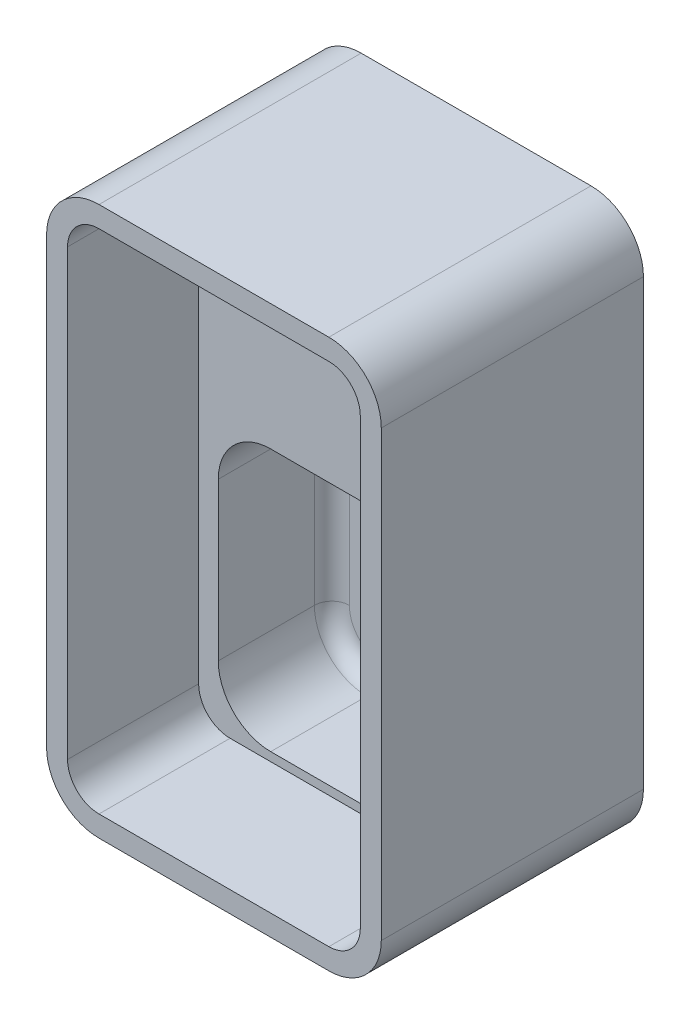
ISO-10303-21;
HEADER;
FILE_DESCRIPTION(('STEP AP214'),'2;1');
FILE_NAME('part.step','',(''),(''),'','','');
FILE_SCHEMA(('AUTOMOTIVE_DESIGN { 1 0 10303 214 1 1 1 1 }'));
ENDSEC;
DATA;
#1=APPLICATION_CONTEXT('core data for automotive mechanical design processes');
#2=APPLICATION_PROTOCOL_DEFINITION('international standard','automotive_design',2000,#1);
#3=PRODUCT_CONTEXT('',#1,'mechanical');
#4=PRODUCT('Part','Part','',(#3));
#5=PRODUCT_RELATED_PRODUCT_CATEGORY('part','',(#4));
#6=PRODUCT_DEFINITION_FORMATION('','',#4);
#7=PRODUCT_DEFINITION_CONTEXT('part definition',#1,'design');
#8=PRODUCT_DEFINITION('design','',#6,#7);
#9=PRODUCT_DEFINITION_SHAPE('','',#8);
#10=(LENGTH_UNIT() NAMED_UNIT(*) SI_UNIT(.MILLI.,.METRE.));
#11=(NAMED_UNIT(*) PLANE_ANGLE_UNIT() SI_UNIT($,.RADIAN.));
#12=(NAMED_UNIT(*) SI_UNIT($,.STERADIAN.) SOLID_ANGLE_UNIT());
#13=UNCERTAINTY_MEASURE_WITH_UNIT(LENGTH_MEASURE(1.E-05),#10,'distance_accuracy_value','');
#14=(GEOMETRIC_REPRESENTATION_CONTEXT(3) GLOBAL_UNCERTAINTY_ASSIGNED_CONTEXT((#13)) GLOBAL_UNIT_ASSIGNED_CONTEXT((#10,
#11,#12)) REPRESENTATION_CONTEXT('',''));
#15=CARTESIAN_POINT('',(0.,0.,0.));
#16=DIRECTION('',(0.,0.,1.));
#17=DIRECTION('',(1.,0.,0.));
#18=AXIS2_PLACEMENT_3D('',#15,#16,#17);
#19=CARTESIAN_POINT('',(0.,0.,15.));
#20=DIRECTION('',(0.,0.,-1.));
#21=DIRECTION('',(-1.,0.,0.));
#22=AXIS2_PLACEMENT_3D('',#19,#20,#21);
#23=PLANE('',#22);
#24=DIRECTION('',(0.,1.,0.));
#25=VECTOR('',#24,1.);
#26=CARTESIAN_POINT('',(14.5,0.,15.));
#27=LINE('',#26,#25);
#28=CARTESIAN_POINT('',(14.5,-9.,15.));
#29=VERTEX_POINT('',#28);
#30=CARTESIAN_POINT('',(14.5,9.,15.));
#31=VERTEX_POINT('',#30);
#32=EDGE_CURVE('E346',#29,#31,#27,.T.);
#33=ORIENTED_EDGE('',*,*,#32,.F.);
#34=CARTESIAN_POINT('',(8.5,-9.,15.));
#35=DIRECTION('',(0.,0.,-1.));
#36=DIRECTION('',(-1.,0.,0.));
#37=AXIS2_PLACEMENT_3D('',#34,#35,#36);
#38=CIRCLE('',#37,6.);
#39=CARTESIAN_POINT('',(8.5,-15.,15.));
#40=VERTEX_POINT('',#39);
#41=EDGE_CURVE('E497',#29,#40,#38,.T.);
#42=ORIENTED_EDGE('',*,*,#41,.T.);
#43=DIRECTION('',(-1.,0.,0.));
#44=VECTOR('',#43,1.);
#45=CARTESIAN_POINT('',(0.,-15.,15.));
#46=LINE('',#45,#44);
#47=CARTESIAN_POINT('',(-8.5,-15.,15.));
#48=VERTEX_POINT('',#47);
#49=EDGE_CURVE('E334',#40,#48,#46,.T.);
#50=ORIENTED_EDGE('',*,*,#49,.T.);
#51=CARTESIAN_POINT('',(-8.5,-9.,15.));
#52=DIRECTION('',(0.,0.,-1.));
#53=DIRECTION('',(-1.,0.,0.));
#54=AXIS2_PLACEMENT_3D('',#51,#52,#53);
#55=CIRCLE('',#54,6.);
#56=CARTESIAN_POINT('',(-14.5,-9.,15.));
#57=VERTEX_POINT('',#56);
#58=EDGE_CURVE('E491',#48,#57,#55,.T.);
#59=ORIENTED_EDGE('',*,*,#58,.T.);
#60=DIRECTION('',(0.,1.,0.));
#61=VECTOR('',#60,1.);
#62=CARTESIAN_POINT('',(-14.5,0.,15.));
#63=LINE('',#62,#61);
#64=CARTESIAN_POINT('',(-14.5,9.00000000000001,15.));
#65=VERTEX_POINT('',#64);
#66=EDGE_CURVE('E338',#57,#65,#63,.T.);
#67=ORIENTED_EDGE('',*,*,#66,.T.);
#68=CARTESIAN_POINT('',(-8.5,9.00000000000001,15.));
#69=DIRECTION('',(0.,0.,-1.));
#70=DIRECTION('',(-1.,0.,0.));
#71=AXIS2_PLACEMENT_3D('',#68,#69,#70);
#72=CIRCLE('',#71,6.);
#73=CARTESIAN_POINT('',(-8.5,15.,15.));
#74=VERTEX_POINT('',#73);
#75=EDGE_CURVE('E494',#65,#74,#72,.T.);
#76=ORIENTED_EDGE('',*,*,#75,.T.);
#77=DIRECTION('',(-1.,0.,0.));
#78=VECTOR('',#77,1.);
#79=CARTESIAN_POINT('',(0.,15.,15.));
#80=LINE('',#79,#78);
#81=CARTESIAN_POINT('',(8.5,15.,15.));
#82=VERTEX_POINT('',#81);
#83=EDGE_CURVE('E342',#82,#74,#80,.T.);
#84=ORIENTED_EDGE('',*,*,#83,.F.);
#85=CARTESIAN_POINT('',(8.5,9.,15.));
#86=DIRECTION('',(0.,0.,-1.));
#87=DIRECTION('',(-1.,0.,0.));
#88=AXIS2_PLACEMENT_3D('',#85,#86,#87);
#89=CIRCLE('',#88,6.);
#90=EDGE_CURVE('E500',#82,#31,#89,.T.);
#91=ORIENTED_EDGE('',*,*,#90,.T.);
#92=EDGE_LOOP('',(#33,#42,#50,#59,#67,#76,#84,#91));
#93=FACE_BOUND('',#92,.T.);
#94=DIRECTION('',(0.,1.,0.));
#95=VECTOR('',#94,1.);
#96=CARTESIAN_POINT('',(-16.75,0.,15.));
#97=LINE('',#96,#95);
#98=CARTESIAN_POINT('',(-16.75,-12.4,15.));
#99=VERTEX_POINT('',#98);
#100=CARTESIAN_POINT('',(-16.75,38.4,15.));
#101=VERTEX_POINT('',#100);
#102=EDGE_CURVE('E295',#99,#101,#97,.T.);
#103=ORIENTED_EDGE('',*,*,#102,.F.);
#104=CARTESIAN_POINT('',(-13.15,-12.4,15.));
#105=DIRECTION('',(0.,0.,-1.));
#106=DIRECTION('',(-1.,0.,0.));
#107=AXIS2_PLACEMENT_3D('',#104,#105,#106);
#108=CIRCLE('',#107,3.6);
#109=CARTESIAN_POINT('',(-13.15,-16.,15.));
#110=VERTEX_POINT('',#109);
#111=EDGE_CURVE('E277',#99,#110,#108,.F.);
#112=ORIENTED_EDGE('',*,*,#111,.T.);
#113=DIRECTION('',(1.,0.,0.));
#114=VECTOR('',#113,1.);
#115=CARTESIAN_POINT('',(0.,-16.,15.));
#116=LINE('',#115,#114);
#117=CARTESIAN_POINT('',(13.15,-16.,15.));
#118=VERTEX_POINT('',#117);
#119=EDGE_CURVE('E307',#110,#118,#116,.T.);
#120=ORIENTED_EDGE('',*,*,#119,.T.);
#121=CARTESIAN_POINT('',(13.15,-12.4,15.));
#122=DIRECTION('',(0.,0.,-1.));
#123=DIRECTION('',(-1.,0.,0.));
#124=AXIS2_PLACEMENT_3D('',#121,#122,#123);
#125=CIRCLE('',#124,3.6);
#126=CARTESIAN_POINT('',(16.75,-12.4,15.));
#127=VERTEX_POINT('',#126);
#128=EDGE_CURVE('E289',#118,#127,#125,.F.);
#129=ORIENTED_EDGE('',*,*,#128,.T.);
#130=DIRECTION('',(0.,1.,0.));
#131=VECTOR('',#130,1.);
#132=CARTESIAN_POINT('',(16.75,0.,15.));
#133=LINE('',#132,#131);
#134=CARTESIAN_POINT('',(16.75,38.4,15.));
#135=VERTEX_POINT('',#134);
#136=EDGE_CURVE('E314',#127,#135,#133,.T.);
#137=ORIENTED_EDGE('',*,*,#136,.T.);
#138=CARTESIAN_POINT('',(13.15,38.4,15.));
#139=DIRECTION('',(0.,0.,-1.));
#140=DIRECTION('',(-1.,0.,0.));
#141=AXIS2_PLACEMENT_3D('',#138,#139,#140);
#142=CIRCLE('',#141,3.6);
#143=CARTESIAN_POINT('',(13.15,42.,15.));
#144=VERTEX_POINT('',#143);
#145=EDGE_CURVE('E300',#135,#144,#142,.F.);
#146=ORIENTED_EDGE('',*,*,#145,.T.);
#147=DIRECTION('',(1.,0.,0.));
#148=VECTOR('',#147,1.);
#149=CARTESIAN_POINT('',(0.,42.,15.));
#150=LINE('',#149,#148);
#151=CARTESIAN_POINT('',(-13.15,42.,15.));
#152=VERTEX_POINT('',#151);
#153=EDGE_CURVE('E577',#152,#144,#150,.T.);
#154=ORIENTED_EDGE('',*,*,#153,.F.);
#155=CARTESIAN_POINT('',(-13.15,38.4,15.));
#156=DIRECTION('',(0.,0.,-1.));
#157=DIRECTION('',(-1.,0.,0.));
#158=AXIS2_PLACEMENT_3D('',#155,#156,#157);
#159=CIRCLE('',#158,3.6);
#160=EDGE_CURVE('E304',#152,#101,#159,.F.);
#161=ORIENTED_EDGE('',*,*,#160,.T.);
#162=EDGE_LOOP('',(#103,#112,#120,#129,#137,#146,#154,#161));
#163=FACE_BOUND('',#162,.T.);
#164=ADVANCED_FACE('F89',(#93,#163),#23,.F.);
#165=CARTESIAN_POINT('',(0.,0.,2.));
#166=DIRECTION('',(0.,0.,1.));
#167=DIRECTION('',(1.,0.,0.));
#168=AXIS2_PLACEMENT_3D('',#165,#166,#167);
#169=PLANE('',#168);
#170=DIRECTION('',(0.,1.,0.));
#171=VECTOR('',#170,1.);
#172=CARTESIAN_POINT('',(12.5,9.,2.));
#173=LINE('',#172,#171);
#174=CARTESIAN_POINT('',(12.5,-9.,2.));
#175=VERTEX_POINT('',#174);
#176=CARTESIAN_POINT('',(12.5,9.,2.));
#177=VERTEX_POINT('',#176);
#178=EDGE_CURVE('E521',#175,#177,#173,.T.);
#179=ORIENTED_EDGE('',*,*,#178,.T.);
#180=CARTESIAN_POINT('',(8.5,9.,2.));
#181=DIRECTION('',(0.,0.,1.));
#182=DIRECTION('',(1.,0.,0.));
#183=AXIS2_PLACEMENT_3D('',#180,#181,#182);
#184=CIRCLE('',#183,4.);
#185=CARTESIAN_POINT('',(8.5,13.,2.));
#186=VERTEX_POINT('',#185);
#187=EDGE_CURVE('E524',#177,#186,#184,.T.);
#188=ORIENTED_EDGE('',*,*,#187,.T.);
#189=DIRECTION('',(-1.,0.,0.));
#190=VECTOR('',#189,1.);
#191=CARTESIAN_POINT('',(-8.5,13.,2.));
#192=LINE('',#191,#190);
#193=CARTESIAN_POINT('',(-8.5,13.,2.));
#194=VERTEX_POINT('',#193);
#195=EDGE_CURVE('E503',#186,#194,#192,.T.);
#196=ORIENTED_EDGE('',*,*,#195,.T.);
#197=CARTESIAN_POINT('',(-8.5,9.00000000000001,2.));
#198=DIRECTION('',(0.,0.,1.));
#199=DIRECTION('',(1.,0.,0.));
#200=AXIS2_PLACEMENT_3D('',#197,#198,#199);
#201=CIRCLE('',#200,4.);
#202=CARTESIAN_POINT('',(-12.5,9.00000000000001,2.));
#203=VERTEX_POINT('',#202);
#204=EDGE_CURVE('E506',#194,#203,#201,.T.);
#205=ORIENTED_EDGE('',*,*,#204,.T.);
#206=DIRECTION('',(0.,1.,0.));
#207=VECTOR('',#206,1.);
#208=CARTESIAN_POINT('',(-12.5,0.,2.));
#209=LINE('',#208,#207);
#210=CARTESIAN_POINT('',(-12.5,-9.,2.));
#211=VERTEX_POINT('',#210);
#212=EDGE_CURVE('E509',#203,#211,#209,.F.);
#213=ORIENTED_EDGE('',*,*,#212,.T.);
#214=CARTESIAN_POINT('',(-8.5,-9.,2.));
#215=DIRECTION('',(0.,0.,1.));
#216=DIRECTION('',(1.,0.,0.));
#217=AXIS2_PLACEMENT_3D('',#214,#215,#216);
#218=CIRCLE('',#217,4.);
#219=CARTESIAN_POINT('',(-8.5,-13.,2.));
#220=VERTEX_POINT('',#219);
#221=EDGE_CURVE('E512',#211,#220,#218,.T.);
#222=ORIENTED_EDGE('',*,*,#221,.T.);
#223=DIRECTION('',(-1.,0.,0.));
#224=VECTOR('',#223,1.);
#225=CARTESIAN_POINT('',(0.,-13.,2.));
#226=LINE('',#225,#224);
#227=CARTESIAN_POINT('',(8.5,-13.,2.));
#228=VERTEX_POINT('',#227);
#229=EDGE_CURVE('E515',#220,#228,#226,.F.);
#230=ORIENTED_EDGE('',*,*,#229,.T.);
#231=CARTESIAN_POINT('',(8.5,-9.,2.));
#232=DIRECTION('',(0.,0.,1.));
#233=DIRECTION('',(1.,0.,0.));
#234=AXIS2_PLACEMENT_3D('',#231,#232,#233);
#235=CIRCLE('',#234,4.);
#236=EDGE_CURVE('E518',#228,#175,#235,.T.);
#237=ORIENTED_EDGE('',*,*,#236,.T.);
#238=EDGE_LOOP('',(#179,#188,#196,#205,#213,#222,#230,#237));
#239=FACE_BOUND('',#238,.T.);
#240=CARTESIAN_POINT('',(0.,0.,2.));
#241=DIRECTION('',(0.,0.,1.));
#242=DIRECTION('',(1.,0.,0.));
#243=AXIS2_PLACEMENT_3D('',#240,#241,#242);
#244=CIRCLE('',#243,7.);
#245=CARTESIAN_POINT('',(7.,0.,2.));
#246=VERTEX_POINT('',#245);
#247=EDGE_CURVE('E351',#246,#246,#244,.T.);
#248=ORIENTED_EDGE('',*,*,#247,.F.);
#249=EDGE_LOOP('',(#248));
#250=FACE_BOUND('',#249,.T.);
#251=ADVANCED_FACE('F627',(#239,#250),#169,.T.);
#252=CARTESIAN_POINT('',(19.15,0.,2.));
#253=DIRECTION('',(1.,0.,0.));
#254=DIRECTION('',(0.,1.,0.));
#255=AXIS2_PLACEMENT_3D('',#252,#253,#254);
#256=PLANE('',#255);
#257=DIRECTION('',(0.,-1.,0.));
#258=VECTOR('',#257,1.);
#259=CARTESIAN_POINT('',(19.15,0.,30.));
#260=LINE('',#259,#258);
#261=CARTESIAN_POINT('',(19.15,38.4,30.));
#262=VERTEX_POINT('',#261);
#263=CARTESIAN_POINT('',(19.15,-12.4,30.));
#264=VERTEX_POINT('',#263);
#265=EDGE_CURVE('E322',#262,#264,#260,.T.);
#266=ORIENTED_EDGE('',*,*,#265,.T.);
#267=DIRECTION('',(0.,0.,-1.));
#268=VECTOR('',#267,1.);
#269=CARTESIAN_POINT('',(19.15,-12.4,0.));
#270=LINE('',#269,#268);
#271=CARTESIAN_POINT('',(19.15,-12.4,0.));
#272=VERTEX_POINT('',#271);
#273=EDGE_CURVE('E442',#264,#272,#270,.T.);
#274=ORIENTED_EDGE('',*,*,#273,.T.);
#275=DIRECTION('',(0.,-1.,0.));
#276=VECTOR('',#275,1.);
#277=CARTESIAN_POINT('',(19.15,0.,0.));
#278=LINE('',#277,#276);
#279=CARTESIAN_POINT('',(19.15,38.4,0.));
#280=VERTEX_POINT('',#279);
#281=EDGE_CURVE('E350',#280,#272,#278,.T.);
#282=ORIENTED_EDGE('',*,*,#281,.F.);
#283=DIRECTION('',(0.,0.,-1.));
#284=VECTOR('',#283,1.);
#285=CARTESIAN_POINT('',(19.15,38.4,2.));
#286=LINE('',#285,#284);
#287=EDGE_CURVE('E439',#280,#262,#286,.F.);
#288=ORIENTED_EDGE('',*,*,#287,.T.);
#289=EDGE_LOOP('',(#266,#274,#282,#288));
#290=FACE_BOUND('',#289,.T.);
#291=ADVANCED_FACE('F633',(#290),#256,.T.);
#292=CARTESIAN_POINT('',(0.,44.4,2.));
#293=DIRECTION('',(0.,1.,0.));
#294=DIRECTION('',(0.,0.,1.));
#295=AXIS2_PLACEMENT_3D('',#292,#293,#294);
#296=PLANE('',#295);
#297=DIRECTION('',(1.,0.,0.));
#298=VECTOR('',#297,1.);
#299=CARTESIAN_POINT('',(0.,44.4,0.));
#300=LINE('',#299,#298);
#301=CARTESIAN_POINT('',(-13.15,44.4,0.));
#302=VERTEX_POINT('',#301);
#303=CARTESIAN_POINT('',(13.15,44.4,0.));
#304=VERTEX_POINT('',#303);
#305=EDGE_CURVE('E359',#302,#304,#300,.T.);
#306=ORIENTED_EDGE('',*,*,#305,.F.);
#307=DIRECTION('',(0.,0.,-1.));
#308=VECTOR('',#307,1.);
#309=CARTESIAN_POINT('',(-13.15,44.4,30.));
#310=LINE('',#309,#308);
#311=CARTESIAN_POINT('',(-13.15,44.4,30.));
#312=VERTEX_POINT('',#311);
#313=EDGE_CURVE('E488',#302,#312,#310,.F.);
#314=ORIENTED_EDGE('',*,*,#313,.T.);
#315=DIRECTION('',(1.,0.,0.));
#316=VECTOR('',#315,1.);
#317=CARTESIAN_POINT('',(0.,44.4,30.));
#318=LINE('',#317,#316);
#319=CARTESIAN_POINT('',(13.15,44.4,30.));
#320=VERTEX_POINT('',#319);
#321=EDGE_CURVE('E326',#312,#320,#318,.T.);
#322=ORIENTED_EDGE('',*,*,#321,.T.);
#323=DIRECTION('',(0.,0.,-1.));
#324=VECTOR('',#323,1.);
#325=CARTESIAN_POINT('',(13.15,44.4,2.));
#326=LINE('',#325,#324);
#327=EDGE_CURVE('E484',#320,#304,#326,.T.);
#328=ORIENTED_EDGE('',*,*,#327,.T.);
#329=EDGE_LOOP('',(#306,#314,#322,#328));
#330=FACE_BOUND('',#329,.T.);
#331=ADVANCED_FACE('F656',(#330),#296,.T.);
#332=CARTESIAN_POINT('',(-19.15,0.,2.));
#333=DIRECTION('',(1.,0.,0.));
#334=DIRECTION('',(0.,1.,0.));
#335=AXIS2_PLACEMENT_3D('',#332,#333,#334);
#336=PLANE('',#335);
#337=DIRECTION('',(0.,-1.,0.));
#338=VECTOR('',#337,1.);
#339=CARTESIAN_POINT('',(-19.15,0.,0.));
#340=LINE('',#339,#338);
#341=CARTESIAN_POINT('',(-19.15,38.4,0.));
#342=VERTEX_POINT('',#341);
#343=CARTESIAN_POINT('',(-19.15,-12.4,0.));
#344=VERTEX_POINT('',#343);
#345=EDGE_CURVE('E363',#342,#344,#340,.T.);
#346=ORIENTED_EDGE('',*,*,#345,.T.);
#347=DIRECTION('',(0.,0.,-1.));
#348=VECTOR('',#347,1.);
#349=CARTESIAN_POINT('',(-19.15,-12.4,2.));
#350=LINE('',#349,#348);
#351=CARTESIAN_POINT('',(-19.15,-12.4,30.));
#352=VERTEX_POINT('',#351);
#353=EDGE_CURVE('E481',#344,#352,#350,.F.);
#354=ORIENTED_EDGE('',*,*,#353,.T.);
#355=DIRECTION('',(0.,-1.,0.));
#356=VECTOR('',#355,1.);
#357=CARTESIAN_POINT('',(-19.15,0.,30.));
#358=LINE('',#357,#356);
#359=CARTESIAN_POINT('',(-19.15,38.4,30.));
#360=VERTEX_POINT('',#359);
#361=EDGE_CURVE('E330',#360,#352,#358,.T.);
#362=ORIENTED_EDGE('',*,*,#361,.F.);
#363=DIRECTION('',(0.,0.,-1.));
#364=VECTOR('',#363,1.);
#365=CARTESIAN_POINT('',(-19.15,38.4,0.));
#366=LINE('',#365,#364);
#367=EDGE_CURVE('E477',#360,#342,#366,.T.);
#368=ORIENTED_EDGE('',*,*,#367,.T.);
#369=EDGE_LOOP('',(#346,#354,#362,#368));
#370=FACE_BOUND('',#369,.T.);
#371=ADVANCED_FACE('F652',(#370),#336,.F.);
#372=CARTESIAN_POINT('',(0.,-18.4,2.));
#373=DIRECTION('',(0.,1.,0.));
#374=DIRECTION('',(0.,0.,1.));
#375=AXIS2_PLACEMENT_3D('',#372,#373,#374);
#376=PLANE('',#375);
#377=DIRECTION('',(1.,0.,0.));
#378=VECTOR('',#377,1.);
#379=CARTESIAN_POINT('',(0.,-18.4,0.));
#380=LINE('',#379,#378);
#381=CARTESIAN_POINT('',(-13.15,-18.4,0.));
#382=VERTEX_POINT('',#381);
#383=CARTESIAN_POINT('',(13.15,-18.4,0.));
#384=VERTEX_POINT('',#383);
#385=EDGE_CURVE('E367',#382,#384,#380,.T.);
#386=ORIENTED_EDGE('',*,*,#385,.T.);
#387=DIRECTION('',(0.,0.,-1.));
#388=VECTOR('',#387,1.);
#389=CARTESIAN_POINT('',(13.15,-18.4,30.));
#390=LINE('',#389,#388);
#391=CARTESIAN_POINT('',(13.15,-18.4,30.));
#392=VERTEX_POINT('',#391);
#393=EDGE_CURVE('E462',#384,#392,#390,.F.);
#394=ORIENTED_EDGE('',*,*,#393,.T.);
#395=DIRECTION('',(1.,0.,0.));
#396=VECTOR('',#395,1.);
#397=CARTESIAN_POINT('',(0.,-18.4,30.));
#398=LINE('',#397,#396);
#399=CARTESIAN_POINT('',(-13.15,-18.4,30.));
#400=VERTEX_POINT('',#399);
#401=EDGE_CURVE('E318',#400,#392,#398,.T.);
#402=ORIENTED_EDGE('',*,*,#401,.F.);
#403=DIRECTION('',(0.,0.,-1.));
#404=VECTOR('',#403,1.);
#405=CARTESIAN_POINT('',(-13.15,-18.4,2.));
#406=LINE('',#405,#404);
#407=EDGE_CURVE('E458',#400,#382,#406,.T.);
#408=ORIENTED_EDGE('',*,*,#407,.T.);
#409=EDGE_LOOP('',(#386,#394,#402,#408));
#410=FACE_BOUND('',#409,.T.);
#411=ADVANCED_FACE('F648',(#410),#376,.F.);
#412=CARTESIAN_POINT('',(0.,0.,2.));
#413=DIRECTION('',(0.,0.,-1.));
#414=DIRECTION('',(-1.,0.,0.));
#415=AXIS2_PLACEMENT_3D('',#412,#413,#414);
#416=CYLINDRICAL_SURFACE('',#415,7.);
#417=ORIENTED_EDGE('',*,*,#247,.T.);
#418=EDGE_LOOP('',(#417));
#419=FACE_BOUND('',#418,.T.);
#420=CARTESIAN_POINT('',(0.,0.,0.));
#421=DIRECTION('',(0.,0.,1.));
#422=DIRECTION('',(1.,0.,0.));
#423=AXIS2_PLACEMENT_3D('',#420,#421,#422);
#424=CIRCLE('',#423,7.);
#425=CARTESIAN_POINT('',(7.,0.,0.));
#426=VERTEX_POINT('',#425);
#427=EDGE_CURVE('E355',#426,#426,#424,.T.);
#428=ORIENTED_EDGE('',*,*,#427,.F.);
#429=EDGE_LOOP('',(#428));
#430=FACE_BOUND('',#429,.T.);
#431=ADVANCED_FACE('F644',(#419,#430),#416,.F.);
#432=CARTESIAN_POINT('',(0.,0.,0.));
#433=DIRECTION('',(0.,0.,1.));
#434=DIRECTION('',(1.,0.,0.));
#435=AXIS2_PLACEMENT_3D('',#432,#433,#434);
#436=PLANE('',#435);
#437=ORIENTED_EDGE('',*,*,#281,.T.);
#438=CARTESIAN_POINT('',(13.15,-12.4,0.));
#439=DIRECTION('',(0.,0.,1.));
#440=DIRECTION('',(1.,0.,0.));
#441=AXIS2_PLACEMENT_3D('',#438,#439,#440);
#442=CIRCLE('',#441,6.);
#443=EDGE_CURVE('E455',#272,#384,#442,.F.);
#444=ORIENTED_EDGE('',*,*,#443,.T.);
#445=ORIENTED_EDGE('',*,*,#385,.F.);
#446=CARTESIAN_POINT('',(-13.15,-12.4,0.));
#447=DIRECTION('',(0.,0.,1.));
#448=DIRECTION('',(1.,0.,0.));
#449=AXIS2_PLACEMENT_3D('',#446,#447,#448);
#450=CIRCLE('',#449,6.);
#451=EDGE_CURVE('E452',#382,#344,#450,.F.);
#452=ORIENTED_EDGE('',*,*,#451,.T.);
#453=ORIENTED_EDGE('',*,*,#345,.F.);
#454=CARTESIAN_POINT('',(-13.15,38.4,0.));
#455=DIRECTION('',(0.,0.,1.));
#456=DIRECTION('',(1.,0.,0.));
#457=AXIS2_PLACEMENT_3D('',#454,#455,#456);
#458=CIRCLE('',#457,6.);
#459=EDGE_CURVE('E449',#342,#302,#458,.F.);
#460=ORIENTED_EDGE('',*,*,#459,.T.);
#461=ORIENTED_EDGE('',*,*,#305,.T.);
#462=CARTESIAN_POINT('',(13.15,38.4,0.));
#463=DIRECTION('',(0.,0.,1.));
#464=DIRECTION('',(1.,0.,0.));
#465=AXIS2_PLACEMENT_3D('',#462,#463,#464);
#466=CIRCLE('',#465,6.);
#467=EDGE_CURVE('E446',#304,#280,#466,.F.);
#468=ORIENTED_EDGE('',*,*,#467,.T.);
#469=EDGE_LOOP('',(#437,#444,#445,#452,#453,#460,#461,#468));
#470=FACE_BOUND('',#469,.T.);
#471=ORIENTED_EDGE('',*,*,#427,.T.);
#472=EDGE_LOOP('',(#471));
#473=FACE_BOUND('',#472,.T.);
#474=ADVANCED_FACE('F641',(#470,#473),#436,.F.);
#475=CARTESIAN_POINT('',(0.,-15.,15.));
#476=DIRECTION('',(0.,-1.,0.));
#477=DIRECTION('',(0.,0.,-1.));
#478=AXIS2_PLACEMENT_3D('',#475,#476,#477);
#479=PLANE('',#478);
#480=DIRECTION('',(0.,0.,-1.));
#481=VECTOR('',#480,1.);
#482=CARTESIAN_POINT('',(8.5,-15.,15.));
#483=LINE('',#482,#481);
#484=CARTESIAN_POINT('',(8.5,-15.,4.));
#485=VERTEX_POINT('',#484);
#486=EDGE_CURVE('E419',#40,#485,#483,.T.);
#487=ORIENTED_EDGE('',*,*,#486,.T.);
#488=DIRECTION('',(-1.,0.,0.));
#489=VECTOR('',#488,1.);
#490=CARTESIAN_POINT('',(0.,-15.,4.));
#491=LINE('',#490,#489);
#492=CARTESIAN_POINT('',(-8.5,-15.,4.));
#493=VERTEX_POINT('',#492);
#494=EDGE_CURVE('E538',#485,#493,#491,.T.);
#495=ORIENTED_EDGE('',*,*,#494,.T.);
#496=DIRECTION('',(0.,0.,-1.));
#497=VECTOR('',#496,1.);
#498=CARTESIAN_POINT('',(-8.5,-15.,15.));
#499=LINE('',#498,#497);
#500=EDGE_CURVE('E423',#493,#48,#499,.F.);
#501=ORIENTED_EDGE('',*,*,#500,.T.);
#502=ORIENTED_EDGE('',*,*,#49,.F.);
#503=EDGE_LOOP('',(#487,#495,#501,#502));
#504=FACE_BOUND('',#503,.T.);
#505=ADVANCED_FACE('F638',(#504),#479,.F.);
#506=CARTESIAN_POINT('',(14.5,0.,15.));
#507=DIRECTION('',(-1.,0.,0.));
#508=DIRECTION('',(0.,-1.,0.));
#509=AXIS2_PLACEMENT_3D('',#506,#507,#508);
#510=PLANE('',#509);
#511=DIRECTION('',(0.,0.,-1.));
#512=VECTOR('',#511,1.);
#513=CARTESIAN_POINT('',(14.5,9.,2.));
#514=LINE('',#513,#512);
#515=CARTESIAN_POINT('',(14.5,9.,4.));
#516=VERTEX_POINT('',#515);
#517=EDGE_CURVE('E432',#31,#516,#514,.T.);
#518=ORIENTED_EDGE('',*,*,#517,.T.);
#519=DIRECTION('',(0.,1.,0.));
#520=VECTOR('',#519,1.);
#521=CARTESIAN_POINT('',(14.5,-9.,4.));
#522=LINE('',#521,#520);
#523=CARTESIAN_POINT('',(14.5,-9.,4.));
#524=VERTEX_POINT('',#523);
#525=EDGE_CURVE('E532',#516,#524,#522,.F.);
#526=ORIENTED_EDGE('',*,*,#525,.T.);
#527=DIRECTION('',(0.,0.,-1.));
#528=VECTOR('',#527,1.);
#529=CARTESIAN_POINT('',(14.5,-9.,15.));
#530=LINE('',#529,#528);
#531=EDGE_CURVE('E436',#524,#29,#530,.F.);
#532=ORIENTED_EDGE('',*,*,#531,.T.);
#533=ORIENTED_EDGE('',*,*,#32,.T.);
#534=EDGE_LOOP('',(#518,#526,#532,#533));
#535=FACE_BOUND('',#534,.T.);
#536=ADVANCED_FACE('F757',(#535),#510,.T.);
#537=CARTESIAN_POINT('',(0.,15.,15.));
#538=DIRECTION('',(0.,-1.,0.));
#539=DIRECTION('',(0.,0.,-1.));
#540=AXIS2_PLACEMENT_3D('',#537,#538,#539);
#541=PLANE('',#540);
#542=DIRECTION('',(0.,0.,-1.));
#543=VECTOR('',#542,1.);
#544=CARTESIAN_POINT('',(-8.5,15.,15.));
#545=LINE('',#544,#543);
#546=CARTESIAN_POINT('',(-8.5,15.,4.));
#547=VERTEX_POINT('',#546);
#548=EDGE_CURVE('E429',#74,#547,#545,.T.);
#549=ORIENTED_EDGE('',*,*,#548,.T.);
#550=DIRECTION('',(-1.,0.,0.));
#551=VECTOR('',#550,1.);
#552=CARTESIAN_POINT('',(8.5,15.,4.));
#553=LINE('',#552,#551);
#554=CARTESIAN_POINT('',(8.5,15.,4.));
#555=VERTEX_POINT('',#554);
#556=EDGE_CURVE('E12',#547,#555,#553,.F.);
#557=ORIENTED_EDGE('',*,*,#556,.T.);
#558=DIRECTION('',(0.,0.,-1.));
#559=VECTOR('',#558,1.);
#560=CARTESIAN_POINT('',(8.5,15.,15.));
#561=LINE('',#560,#559);
#562=EDGE_CURVE('E426',#555,#82,#561,.F.);
#563=ORIENTED_EDGE('',*,*,#562,.T.);
#564=ORIENTED_EDGE('',*,*,#83,.T.);
#565=EDGE_LOOP('',(#549,#557,#563,#564));
#566=FACE_BOUND('',#565,.T.);
#567=ADVANCED_FACE('F745',(#566),#541,.T.);
#568=CARTESIAN_POINT('',(-14.5,0.,15.));
#569=DIRECTION('',(-1.,0.,0.));
#570=DIRECTION('',(0.,-1.,0.));
#571=AXIS2_PLACEMENT_3D('',#568,#569,#570);
#572=PLANE('',#571);
#573=DIRECTION('',(0.,0.,-1.));
#574=VECTOR('',#573,1.);
#575=CARTESIAN_POINT('',(-14.5,-9.,2.));
#576=LINE('',#575,#574);
#577=CARTESIAN_POINT('',(-14.5,-9.,4.));
#578=VERTEX_POINT('',#577);
#579=EDGE_CURVE('E416',#57,#578,#576,.T.);
#580=ORIENTED_EDGE('',*,*,#579,.T.);
#581=DIRECTION('',(0.,1.,0.));
#582=VECTOR('',#581,1.);
#583=CARTESIAN_POINT('',(-14.5,0.,4.));
#584=LINE('',#583,#582);
#585=CARTESIAN_POINT('',(-14.5,9.00000000000001,4.));
#586=VERTEX_POINT('',#585);
#587=EDGE_CURVE('E114',#578,#586,#584,.T.);
#588=ORIENTED_EDGE('',*,*,#587,.T.);
#589=DIRECTION('',(0.,0.,-1.));
#590=VECTOR('',#589,1.);
#591=CARTESIAN_POINT('',(-14.5,9.00000000000001,15.));
#592=LINE('',#591,#590);
#593=EDGE_CURVE('E413',#586,#65,#592,.F.);
#594=ORIENTED_EDGE('',*,*,#593,.T.);
#595=ORIENTED_EDGE('',*,*,#66,.F.);
#596=EDGE_LOOP('',(#580,#588,#594,#595));
#597=FACE_BOUND('',#596,.T.);
#598=ADVANCED_FACE('F770',(#597),#572,.F.);
#599=CARTESIAN_POINT('',(0.,0.,30.));
#600=DIRECTION('',(0.,0.,-1.));
#601=DIRECTION('',(-1.,0.,0.));
#602=AXIS2_PLACEMENT_3D('',#599,#600,#601);
#603=PLANE('',#602);
#604=DIRECTION('',(1.,0.,0.));
#605=VECTOR('',#604,1.);
#606=CARTESIAN_POINT('',(0.,-16.,30.));
#607=LINE('',#606,#605);
#608=CARTESIAN_POINT('',(-13.15,-16.,30.));
#609=VERTEX_POINT('',#608);
#610=CARTESIAN_POINT('',(13.15,-16.,30.));
#611=VERTEX_POINT('',#610);
#612=EDGE_CURVE('E592',#609,#611,#607,.T.);
#613=ORIENTED_EDGE('',*,*,#612,.F.);
#614=CARTESIAN_POINT('',(-13.15,-12.4,30.));
#615=DIRECTION('',(0.,0.,-1.));
#616=DIRECTION('',(-1.,0.,0.));
#617=AXIS2_PLACEMENT_3D('',#614,#615,#616);
#618=CIRCLE('',#617,3.6);
#619=CARTESIAN_POINT('',(-16.75,-12.4,30.));
#620=VERTEX_POINT('',#619);
#621=EDGE_CURVE('E401',#609,#620,#618,.T.);
#622=ORIENTED_EDGE('',*,*,#621,.T.);
#623=DIRECTION('',(0.,1.,0.));
#624=VECTOR('',#623,1.);
#625=CARTESIAN_POINT('',(-16.75,0.,30.));
#626=LINE('',#625,#624);
#627=CARTESIAN_POINT('',(-16.75,38.4,30.));
#628=VERTEX_POINT('',#627);
#629=EDGE_CURVE('E298',#620,#628,#626,.T.);
#630=ORIENTED_EDGE('',*,*,#629,.T.);
#631=CARTESIAN_POINT('',(-13.15,38.4,30.));
#632=DIRECTION('',(0.,0.,-1.));
#633=DIRECTION('',(-1.,0.,0.));
#634=AXIS2_PLACEMENT_3D('',#631,#632,#633);
#635=CIRCLE('',#634,3.6);
#636=CARTESIAN_POINT('',(-13.15,42.,30.));
#637=VERTEX_POINT('',#636);
#638=EDGE_CURVE('E407',#628,#637,#635,.T.);
#639=ORIENTED_EDGE('',*,*,#638,.T.);
#640=DIRECTION('',(1.,0.,0.));
#641=VECTOR('',#640,1.);
#642=CARTESIAN_POINT('',(0.,42.,30.));
#643=LINE('',#642,#641);
#644=CARTESIAN_POINT('',(13.15,42.,30.));
#645=VERTEX_POINT('',#644);
#646=EDGE_CURVE('E306',#637,#645,#643,.T.);
#647=ORIENTED_EDGE('',*,*,#646,.T.);
#648=CARTESIAN_POINT('',(13.15,38.4,30.));
#649=DIRECTION('',(0.,0.,-1.));
#650=DIRECTION('',(-1.,0.,0.));
#651=AXIS2_PLACEMENT_3D('',#648,#649,#650);
#652=CIRCLE('',#651,3.6);
#653=CARTESIAN_POINT('',(16.75,38.4,30.));
#654=VERTEX_POINT('',#653);
#655=EDGE_CURVE('E410',#645,#654,#652,.T.);
#656=ORIENTED_EDGE('',*,*,#655,.T.);
#657=DIRECTION('',(0.,1.,0.));
#658=VECTOR('',#657,1.);
#659=CARTESIAN_POINT('',(16.75,0.,30.));
#660=LINE('',#659,#658);
#661=CARTESIAN_POINT('',(16.75,-12.4,30.));
#662=VERTEX_POINT('',#661);
#663=EDGE_CURVE('E312',#662,#654,#660,.T.);
#664=ORIENTED_EDGE('',*,*,#663,.F.);
#665=CARTESIAN_POINT('',(13.15,-12.4,30.));
#666=DIRECTION('',(0.,0.,-1.));
#667=DIRECTION('',(-1.,0.,0.));
#668=AXIS2_PLACEMENT_3D('',#665,#666,#667);
#669=CIRCLE('',#668,3.6);
#670=EDGE_CURVE('E404',#662,#611,#669,.T.);
#671=ORIENTED_EDGE('',*,*,#670,.T.);
#672=EDGE_LOOP('',(#613,#622,#630,#639,#647,#656,#664,#671));
#673=FACE_BOUND('',#672,.T.);
#674=ORIENTED_EDGE('',*,*,#401,.T.);
#675=CARTESIAN_POINT('',(13.15,-12.4,30.));
#676=DIRECTION('',(0.,0.,-1.));
#677=DIRECTION('',(-1.,0.,0.));
#678=AXIS2_PLACEMENT_3D('',#675,#676,#677);
#679=CIRCLE('',#678,6.);
#680=EDGE_CURVE('E474',#392,#264,#679,.F.);
#681=ORIENTED_EDGE('',*,*,#680,.T.);
#682=ORIENTED_EDGE('',*,*,#265,.F.);
#683=CARTESIAN_POINT('',(13.15,38.4,30.));
#684=DIRECTION('',(0.,0.,-1.));
#685=DIRECTION('',(-1.,0.,0.));
#686=AXIS2_PLACEMENT_3D('',#683,#684,#685);
#687=CIRCLE('',#686,6.);
#688=EDGE_CURVE('E465',#262,#320,#687,.F.);
#689=ORIENTED_EDGE('',*,*,#688,.T.);
#690=ORIENTED_EDGE('',*,*,#321,.F.);
#691=CARTESIAN_POINT('',(-13.15,38.4,30.));
#692=DIRECTION('',(0.,0.,-1.));
#693=DIRECTION('',(-1.,0.,0.));
#694=AXIS2_PLACEMENT_3D('',#691,#692,#693);
#695=CIRCLE('',#694,6.);
#696=EDGE_CURVE('E468',#312,#360,#695,.F.);
#697=ORIENTED_EDGE('',*,*,#696,.T.);
#698=ORIENTED_EDGE('',*,*,#361,.T.);
#699=CARTESIAN_POINT('',(-13.15,-12.4,30.));
#700=DIRECTION('',(0.,0.,-1.));
#701=DIRECTION('',(-1.,0.,0.));
#702=AXIS2_PLACEMENT_3D('',#699,#700,#701);
#703=CIRCLE('',#702,6.);
#704=EDGE_CURVE('E471',#352,#400,#703,.F.);
#705=ORIENTED_EDGE('',*,*,#704,.T.);
#706=EDGE_LOOP('',(#674,#681,#682,#689,#690,#697,#698,#705));
#707=FACE_BOUND('',#706,.T.);
#708=ADVANCED_FACE('F613',(#673,#707),#603,.F.);
#709=CARTESIAN_POINT('',(0.,42.,30.));
#710=DIRECTION('',(0.,1.,0.));
#711=DIRECTION('',(0.,0.,1.));
#712=AXIS2_PLACEMENT_3D('',#709,#710,#711);
#713=PLANE('',#712);
#714=ORIENTED_EDGE('',*,*,#646,.F.);
#715=DIRECTION('',(0.,0.,-1.));
#716=VECTOR('',#715,1.);
#717=CARTESIAN_POINT('',(-13.15,42.,15.));
#718=LINE('',#717,#716);
#719=EDGE_CURVE('E397',#637,#152,#718,.T.);
#720=ORIENTED_EDGE('',*,*,#719,.T.);
#721=ORIENTED_EDGE('',*,*,#153,.T.);
#722=DIRECTION('',(0.,0.,-1.));
#723=VECTOR('',#722,1.);
#724=CARTESIAN_POINT('',(13.15,42.,30.));
#725=LINE('',#724,#723);
#726=EDGE_CURVE('E394',#144,#645,#725,.F.);
#727=ORIENTED_EDGE('',*,*,#726,.T.);
#728=EDGE_LOOP('',(#714,#720,#721,#727));
#729=FACE_BOUND('',#728,.T.);
#730=ADVANCED_FACE('F624',(#729),#713,.F.);
#731=CARTESIAN_POINT('',(-16.75,0.,30.));
#732=DIRECTION('',(-1.,0.,0.));
#733=DIRECTION('',(0.,0.,1.));
#734=AXIS2_PLACEMENT_3D('',#731,#732,#733);
#735=PLANE('',#734);
#736=ORIENTED_EDGE('',*,*,#629,.F.);
#737=DIRECTION('',(0.,0.,-1.));
#738=VECTOR('',#737,1.);
#739=CARTESIAN_POINT('',(-16.75,-12.4,30.));
#740=LINE('',#739,#738);
#741=EDGE_CURVE('E281',#620,#99,#740,.T.);
#742=ORIENTED_EDGE('',*,*,#741,.T.);
#743=ORIENTED_EDGE('',*,*,#102,.T.);
#744=DIRECTION('',(0.,0.,-1.));
#745=VECTOR('',#744,1.);
#746=CARTESIAN_POINT('',(-16.75,38.4,30.));
#747=LINE('',#746,#745);
#748=EDGE_CURVE('E301',#101,#628,#747,.F.);
#749=ORIENTED_EDGE('',*,*,#748,.T.);
#750=EDGE_LOOP('',(#736,#742,#743,#749));
#751=FACE_BOUND('',#750,.T.);
#752=ADVANCED_FACE('F294',(#751),#735,.F.);
#753=CARTESIAN_POINT('',(0.,-16.,30.));
#754=DIRECTION('',(0.,1.,0.));
#755=DIRECTION('',(0.,0.,1.));
#756=AXIS2_PLACEMENT_3D('',#753,#754,#755);
#757=PLANE('',#756);
#758=ORIENTED_EDGE('',*,*,#119,.F.);
#759=DIRECTION('',(0.,0.,-1.));
#760=VECTOR('',#759,1.);
#761=CARTESIAN_POINT('',(-13.15,-16.,30.));
#762=LINE('',#761,#760);
#763=EDGE_CURVE('E282',#110,#609,#762,.F.);
#764=ORIENTED_EDGE('',*,*,#763,.T.);
#765=ORIENTED_EDGE('',*,*,#612,.T.);
#766=DIRECTION('',(0.,0.,-1.));
#767=VECTOR('',#766,1.);
#768=CARTESIAN_POINT('',(13.15,-16.,15.));
#769=LINE('',#768,#767);
#770=EDGE_CURVE('E288',#611,#118,#769,.T.);
#771=ORIENTED_EDGE('',*,*,#770,.T.);
#772=EDGE_LOOP('',(#758,#764,#765,#771));
#773=FACE_BOUND('',#772,.T.);
#774=ADVANCED_FACE('F616',(#773),#757,.T.);
#775=CARTESIAN_POINT('',(16.75,0.,30.));
#776=DIRECTION('',(-1.,0.,0.));
#777=DIRECTION('',(0.,-1.,0.));
#778=AXIS2_PLACEMENT_3D('',#775,#776,#777);
#779=PLANE('',#778);
#780=ORIENTED_EDGE('',*,*,#136,.F.);
#781=DIRECTION('',(0.,0.,-1.));
#782=VECTOR('',#781,1.);
#783=CARTESIAN_POINT('',(16.75,-12.4,30.));
#784=LINE('',#783,#782);
#785=EDGE_CURVE('E391',#127,#662,#784,.F.);
#786=ORIENTED_EDGE('',*,*,#785,.T.);
#787=ORIENTED_EDGE('',*,*,#663,.T.);
#788=DIRECTION('',(0.,0.,-1.));
#789=VECTOR('',#788,1.);
#790=CARTESIAN_POINT('',(16.75,38.4,30.));
#791=LINE('',#790,#789);
#792=EDGE_CURVE('E387',#654,#135,#791,.T.);
#793=ORIENTED_EDGE('',*,*,#792,.T.);
#794=EDGE_LOOP('',(#780,#786,#787,#793));
#795=FACE_BOUND('',#794,.T.);
#796=ADVANCED_FACE('F602',(#795),#779,.T.);
#797=CARTESIAN_POINT('',(-13.15,-12.4,30.));
#798=DIRECTION('',(0.,0.,-1.));
#799=DIRECTION('',(-1.,0.,0.));
#800=AXIS2_PLACEMENT_3D('',#797,#798,#799);
#801=CYLINDRICAL_SURFACE('',#800,3.6);
#802=ORIENTED_EDGE('',*,*,#621,.F.);
#803=ORIENTED_EDGE('',*,*,#763,.F.);
#804=ORIENTED_EDGE('',*,*,#111,.F.);
#805=ORIENTED_EDGE('',*,*,#741,.F.);
#806=EDGE_LOOP('',(#802,#803,#804,#805));
#807=FACE_BOUND('',#806,.T.);
#808=ADVANCED_FACE('F280',(#807),#801,.F.);
#809=CARTESIAN_POINT('',(13.15,-12.4,30.));
#810=DIRECTION('',(0.,0.,1.));
#811=DIRECTION('',(1.,0.,0.));
#812=AXIS2_PLACEMENT_3D('',#809,#810,#811);
#813=CYLINDRICAL_SURFACE('',#812,3.6);
#814=ORIENTED_EDGE('',*,*,#670,.F.);
#815=ORIENTED_EDGE('',*,*,#785,.F.);
#816=ORIENTED_EDGE('',*,*,#128,.F.);
#817=ORIENTED_EDGE('',*,*,#770,.F.);
#818=EDGE_LOOP('',(#814,#815,#816,#817));
#819=FACE_BOUND('',#818,.T.);
#820=ADVANCED_FACE('F610',(#819),#813,.F.);
#821=CARTESIAN_POINT('',(-13.15,38.4,30.));
#822=DIRECTION('',(0.,0.,1.));
#823=DIRECTION('',(1.,0.,0.));
#824=AXIS2_PLACEMENT_3D('',#821,#822,#823);
#825=CYLINDRICAL_SURFACE('',#824,3.6);
#826=ORIENTED_EDGE('',*,*,#638,.F.);
#827=ORIENTED_EDGE('',*,*,#748,.F.);
#828=ORIENTED_EDGE('',*,*,#160,.F.);
#829=ORIENTED_EDGE('',*,*,#719,.F.);
#830=EDGE_LOOP('',(#826,#827,#828,#829));
#831=FACE_BOUND('',#830,.T.);
#832=ADVANCED_FACE('F668',(#831),#825,.F.);
#833=CARTESIAN_POINT('',(13.15,38.4,30.));
#834=DIRECTION('',(0.,0.,-1.));
#835=DIRECTION('',(-1.,0.,0.));
#836=AXIS2_PLACEMENT_3D('',#833,#834,#835);
#837=CYLINDRICAL_SURFACE('',#836,3.6);
#838=ORIENTED_EDGE('',*,*,#655,.F.);
#839=ORIENTED_EDGE('',*,*,#726,.F.);
#840=ORIENTED_EDGE('',*,*,#145,.F.);
#841=ORIENTED_EDGE('',*,*,#792,.F.);
#842=EDGE_LOOP('',(#838,#839,#840,#841));
#843=FACE_BOUND('',#842,.T.);
#844=ADVANCED_FACE('F608',(#843),#837,.F.);
#845=CARTESIAN_POINT('',(-8.5,-9.,15.));
#846=DIRECTION('',(0.,0.,1.));
#847=DIRECTION('',(1.,0.,0.));
#848=AXIS2_PLACEMENT_3D('',#845,#846,#847);
#849=CYLINDRICAL_SURFACE('',#848,6.);
#850=ORIENTED_EDGE('',*,*,#500,.F.);
#851=CARTESIAN_POINT('',(-8.5,-9.,4.));
#852=DIRECTION('',(0.,0.,1.));
#853=DIRECTION('',(1.,0.,0.));
#854=AXIS2_PLACEMENT_3D('',#851,#852,#853);
#855=CIRCLE('',#854,6.);
#856=EDGE_CURVE('E541',#493,#578,#855,.F.);
#857=ORIENTED_EDGE('',*,*,#856,.T.);
#858=ORIENTED_EDGE('',*,*,#579,.F.);
#859=ORIENTED_EDGE('',*,*,#58,.F.);
#860=EDGE_LOOP('',(#850,#857,#858,#859));
#861=FACE_BOUND('',#860,.T.);
#862=ADVANCED_FACE('F674',(#861),#849,.F.);
#863=CARTESIAN_POINT('',(-8.5,9.00000000000001,15.));
#864=DIRECTION('',(0.,0.,-1.));
#865=DIRECTION('',(-1.,0.,0.));
#866=AXIS2_PLACEMENT_3D('',#863,#864,#865);
#867=CYLINDRICAL_SURFACE('',#866,6.);
#868=ORIENTED_EDGE('',*,*,#593,.F.);
#869=CARTESIAN_POINT('',(-8.5,9.00000000000001,4.));
#870=DIRECTION('',(0.,0.,1.));
#871=DIRECTION('',(1.,0.,0.));
#872=AXIS2_PLACEMENT_3D('',#869,#870,#871);
#873=CIRCLE('',#872,6.);
#874=EDGE_CURVE('E99',#586,#547,#873,.F.);
#875=ORIENTED_EDGE('',*,*,#874,.T.);
#876=ORIENTED_EDGE('',*,*,#548,.F.);
#877=ORIENTED_EDGE('',*,*,#75,.F.);
#878=EDGE_LOOP('',(#868,#875,#876,#877));
#879=FACE_BOUND('',#878,.T.);
#880=ADVANCED_FACE('F677',(#879),#867,.F.);
#881=CARTESIAN_POINT('',(8.5,-9.,15.));
#882=DIRECTION('',(0.,0.,-1.));
#883=DIRECTION('',(-1.,0.,0.));
#884=AXIS2_PLACEMENT_3D('',#881,#882,#883);
#885=CYLINDRICAL_SURFACE('',#884,6.);
#886=ORIENTED_EDGE('',*,*,#531,.F.);
#887=CARTESIAN_POINT('',(8.5,-9.,4.));
#888=DIRECTION('',(0.,0.,1.));
#889=DIRECTION('',(1.,0.,0.));
#890=AXIS2_PLACEMENT_3D('',#887,#888,#889);
#891=CIRCLE('',#890,6.);
#892=EDGE_CURVE('E535',#524,#485,#891,.F.);
#893=ORIENTED_EDGE('',*,*,#892,.T.);
#894=ORIENTED_EDGE('',*,*,#486,.F.);
#895=ORIENTED_EDGE('',*,*,#41,.F.);
#896=EDGE_LOOP('',(#886,#893,#894,#895));
#897=FACE_BOUND('',#896,.T.);
#898=ADVANCED_FACE('F681',(#897),#885,.F.);
#899=CARTESIAN_POINT('',(8.5,9.,15.));
#900=DIRECTION('',(0.,0.,1.));
#901=DIRECTION('',(1.,0.,0.));
#902=AXIS2_PLACEMENT_3D('',#899,#900,#901);
#903=CYLINDRICAL_SURFACE('',#902,6.);
#904=ORIENTED_EDGE('',*,*,#562,.F.);
#905=CARTESIAN_POINT('',(8.5,9.,4.));
#906=DIRECTION('',(0.,0.,1.));
#907=DIRECTION('',(1.,0.,0.));
#908=AXIS2_PLACEMENT_3D('',#905,#906,#907);
#909=CIRCLE('',#908,6.);
#910=EDGE_CURVE('E528',#555,#516,#909,.F.);
#911=ORIENTED_EDGE('',*,*,#910,.T.);
#912=ORIENTED_EDGE('',*,*,#517,.F.);
#913=ORIENTED_EDGE('',*,*,#90,.F.);
#914=EDGE_LOOP('',(#904,#911,#912,#913));
#915=FACE_BOUND('',#914,.T.);
#916=ADVANCED_FACE('F684',(#915),#903,.F.);
#917=CARTESIAN_POINT('',(13.15,-12.4,2.));
#918=DIRECTION('',(0.,0.,1.));
#919=DIRECTION('',(1.,0.,0.));
#920=AXIS2_PLACEMENT_3D('',#917,#918,#919);
#921=CYLINDRICAL_SURFACE('',#920,6.);
#922=ORIENTED_EDGE('',*,*,#680,.F.);
#923=ORIENTED_EDGE('',*,*,#393,.F.);
#924=ORIENTED_EDGE('',*,*,#443,.F.);
#925=ORIENTED_EDGE('',*,*,#273,.F.);
#926=EDGE_LOOP('',(#922,#923,#924,#925));
#927=FACE_BOUND('',#926,.T.);
#928=ADVANCED_FACE('F688',(#927),#921,.T.);
#929=CARTESIAN_POINT('',(-13.15,-12.4,2.));
#930=DIRECTION('',(0.,0.,-1.));
#931=DIRECTION('',(-1.,0.,0.));
#932=AXIS2_PLACEMENT_3D('',#929,#930,#931);
#933=CYLINDRICAL_SURFACE('',#932,6.);
#934=ORIENTED_EDGE('',*,*,#704,.F.);
#935=ORIENTED_EDGE('',*,*,#353,.F.);
#936=ORIENTED_EDGE('',*,*,#451,.F.);
#937=ORIENTED_EDGE('',*,*,#407,.F.);
#938=EDGE_LOOP('',(#934,#935,#936,#937));
#939=FACE_BOUND('',#938,.T.);
#940=ADVANCED_FACE('F692',(#939),#933,.T.);
#941=CARTESIAN_POINT('',(-13.15,38.4,2.));
#942=DIRECTION('',(0.,0.,1.));
#943=DIRECTION('',(1.,0.,0.));
#944=AXIS2_PLACEMENT_3D('',#941,#942,#943);
#945=CYLINDRICAL_SURFACE('',#944,6.);
#946=ORIENTED_EDGE('',*,*,#696,.F.);
#947=ORIENTED_EDGE('',*,*,#313,.F.);
#948=ORIENTED_EDGE('',*,*,#459,.F.);
#949=ORIENTED_EDGE('',*,*,#367,.F.);
#950=EDGE_LOOP('',(#946,#947,#948,#949));
#951=FACE_BOUND('',#950,.T.);
#952=ADVANCED_FACE('F696',(#951),#945,.T.);
#953=CARTESIAN_POINT('',(13.15,38.4,2.));
#954=DIRECTION('',(0.,0.,-1.));
#955=DIRECTION('',(-1.,0.,0.));
#956=AXIS2_PLACEMENT_3D('',#953,#954,#955);
#957=CYLINDRICAL_SURFACE('',#956,6.);
#958=ORIENTED_EDGE('',*,*,#688,.F.);
#959=ORIENTED_EDGE('',*,*,#287,.F.);
#960=ORIENTED_EDGE('',*,*,#467,.F.);
#961=ORIENTED_EDGE('',*,*,#327,.F.);
#962=EDGE_LOOP('',(#958,#959,#960,#961));
#963=FACE_BOUND('',#962,.T.);
#964=ADVANCED_FACE('F700',(#963),#957,.T.);
#965=CARTESIAN_POINT('',(-8.5,-9.,4.));
#966=DIRECTION('',(0.,0.,1.));
#967=DIRECTION('',(1.,0.,0.));
#968=AXIS2_PLACEMENT_3D('',#965,#966,#967);
#969=TOROIDAL_SURFACE('',#968,4.,2.);
#970=CARTESIAN_POINT('',(-12.5,-9.,4.));
#971=DIRECTION('',(0.,-1.,0.));
#972=DIRECTION('',(0.,0.,-1.));
#973=AXIS2_PLACEMENT_3D('',#970,#971,#972);
#974=CIRCLE('',#973,2.);
#975=EDGE_CURVE('E569',#578,#211,#974,.T.);
#976=ORIENTED_EDGE('',*,*,#975,.F.);
#977=ORIENTED_EDGE('',*,*,#856,.F.);
#978=CARTESIAN_POINT('',(-8.5,-13.,4.));
#979=DIRECTION('',(-1.,0.,0.));
#980=DIRECTION('',(0.,0.,1.));
#981=AXIS2_PLACEMENT_3D('',#978,#979,#980);
#982=CIRCLE('',#981,2.);
#983=EDGE_CURVE('E93',#220,#493,#982,.T.);
#984=ORIENTED_EDGE('',*,*,#983,.F.);
#985=ORIENTED_EDGE('',*,*,#221,.F.);
#986=EDGE_LOOP('',(#976,#977,#984,#985));
#987=FACE_BOUND('',#986,.T.);
#988=ADVANCED_FACE('F91',(#987),#969,.F.);
#989=CARTESIAN_POINT('',(0.,-13.,4.));
#990=DIRECTION('',(-1.,0.,0.));
#991=DIRECTION('',(0.,0.,1.));
#992=AXIS2_PLACEMENT_3D('',#989,#990,#991);
#993=CYLINDRICAL_SURFACE('',#992,2.);
#994=ORIENTED_EDGE('',*,*,#983,.T.);
#995=ORIENTED_EDGE('',*,*,#494,.F.);
#996=CARTESIAN_POINT('',(8.5,-13.,4.));
#997=DIRECTION('',(-1.,0.,0.));
#998=DIRECTION('',(0.,0.,1.));
#999=AXIS2_PLACEMENT_3D('',#996,#997,#998);
#1000=CIRCLE('',#999,2.);
#1001=EDGE_CURVE('E566',#228,#485,#1000,.T.);
#1002=ORIENTED_EDGE('',*,*,#1001,.F.);
#1003=ORIENTED_EDGE('',*,*,#229,.F.);
#1004=EDGE_LOOP('',(#994,#995,#1002,#1003));
#1005=FACE_BOUND('',#1004,.T.);
#1006=ADVANCED_FACE('F727',(#1005),#993,.F.);
#1007=CARTESIAN_POINT('',(-12.5,0.,4.));
#1008=DIRECTION('',(0.,1.,0.));
#1009=DIRECTION('',(-1.,0.,0.));
#1010=AXIS2_PLACEMENT_3D('',#1007,#1008,#1009);
#1011=CYLINDRICAL_SURFACE('',#1010,2.);
#1012=ORIENTED_EDGE('',*,*,#975,.T.);
#1013=ORIENTED_EDGE('',*,*,#212,.F.);
#1014=CARTESIAN_POINT('',(-12.5,9.00000000000001,4.));
#1015=DIRECTION('',(0.,-1.,0.));
#1016=DIRECTION('',(0.,0.,-1.));
#1017=AXIS2_PLACEMENT_3D('',#1014,#1015,#1016);
#1018=CIRCLE('',#1017,2.);
#1019=EDGE_CURVE('E562',#586,#203,#1018,.T.);
#1020=ORIENTED_EDGE('',*,*,#1019,.F.);
#1021=ORIENTED_EDGE('',*,*,#587,.F.);
#1022=EDGE_LOOP('',(#1012,#1013,#1020,#1021));
#1023=FACE_BOUND('',#1022,.T.);
#1024=ADVANCED_FACE('F724',(#1023),#1011,.F.);
#1025=CARTESIAN_POINT('',(8.5,-9.,4.));
#1026=DIRECTION('',(0.,0.,1.));
#1027=DIRECTION('',(1.,0.,0.));
#1028=AXIS2_PLACEMENT_3D('',#1025,#1026,#1027);
#1029=TOROIDAL_SURFACE('',#1028,4.,2.);
#1030=ORIENTED_EDGE('',*,*,#1001,.T.);
#1031=ORIENTED_EDGE('',*,*,#892,.F.);
#1032=CARTESIAN_POINT('',(12.5,-9.,4.));
#1033=DIRECTION('',(0.,-1.,0.));
#1034=DIRECTION('',(0.,0.,-1.));
#1035=AXIS2_PLACEMENT_3D('',#1032,#1033,#1034);
#1036=CIRCLE('',#1035,2.);
#1037=EDGE_CURVE('E558',#175,#524,#1036,.T.);
#1038=ORIENTED_EDGE('',*,*,#1037,.F.);
#1039=ORIENTED_EDGE('',*,*,#236,.F.);
#1040=EDGE_LOOP('',(#1030,#1031,#1038,#1039));
#1041=FACE_BOUND('',#1040,.T.);
#1042=ADVANCED_FACE('F720',(#1041),#1029,.F.);
#1043=CARTESIAN_POINT('',(-8.5,9.00000000000001,4.));
#1044=DIRECTION('',(0.,0.,1.));
#1045=DIRECTION('',(1.,0.,0.));
#1046=AXIS2_PLACEMENT_3D('',#1043,#1044,#1045);
#1047=TOROIDAL_SURFACE('',#1046,4.,2.);
#1048=ORIENTED_EDGE('',*,*,#1019,.T.);
#1049=ORIENTED_EDGE('',*,*,#204,.F.);
#1050=CARTESIAN_POINT('',(-8.5,13.,4.));
#1051=DIRECTION('',(-1.,0.,0.));
#1052=DIRECTION('',(0.,0.,1.));
#1053=AXIS2_PLACEMENT_3D('',#1050,#1051,#1052);
#1054=CIRCLE('',#1053,2.);
#1055=EDGE_CURVE('E554',#547,#194,#1054,.T.);
#1056=ORIENTED_EDGE('',*,*,#1055,.F.);
#1057=ORIENTED_EDGE('',*,*,#874,.F.);
#1058=EDGE_LOOP('',(#1048,#1049,#1056,#1057));
#1059=FACE_BOUND('',#1058,.T.);
#1060=ADVANCED_FACE('F716',(#1059),#1047,.F.);
#1061=CARTESIAN_POINT('',(12.5,0.,4.));
#1062=DIRECTION('',(0.,-1.,0.));
#1063=DIRECTION('',(1.,0.,0.));
#1064=AXIS2_PLACEMENT_3D('',#1061,#1062,#1063);
#1065=CYLINDRICAL_SURFACE('',#1064,2.);
#1066=ORIENTED_EDGE('',*,*,#1037,.T.);
#1067=ORIENTED_EDGE('',*,*,#525,.F.);
#1068=CARTESIAN_POINT('',(12.5,9.,4.));
#1069=DIRECTION('',(0.,-1.,0.));
#1070=DIRECTION('',(0.,0.,-1.));
#1071=AXIS2_PLACEMENT_3D('',#1068,#1069,#1070);
#1072=CIRCLE('',#1071,2.);
#1073=EDGE_CURVE('E551',#177,#516,#1072,.T.);
#1074=ORIENTED_EDGE('',*,*,#1073,.F.);
#1075=ORIENTED_EDGE('',*,*,#178,.F.);
#1076=EDGE_LOOP('',(#1066,#1067,#1074,#1075));
#1077=FACE_BOUND('',#1076,.T.);
#1078=ADVANCED_FACE('F712',(#1077),#1065,.F.);
#1079=CARTESIAN_POINT('',(0.,13.,4.));
#1080=DIRECTION('',(1.,0.,0.));
#1081=DIRECTION('',(0.,0.,-1.));
#1082=AXIS2_PLACEMENT_3D('',#1079,#1080,#1081);
#1083=CYLINDRICAL_SURFACE('',#1082,2.);
#1084=ORIENTED_EDGE('',*,*,#1055,.T.);
#1085=ORIENTED_EDGE('',*,*,#195,.F.);
#1086=CARTESIAN_POINT('',(8.5,13.,4.));
#1087=DIRECTION('',(-1.,0.,0.));
#1088=DIRECTION('',(0.,0.,1.));
#1089=AXIS2_PLACEMENT_3D('',#1086,#1087,#1088);
#1090=CIRCLE('',#1089,2.);
#1091=EDGE_CURVE('E548',#555,#186,#1090,.T.);
#1092=ORIENTED_EDGE('',*,*,#1091,.F.);
#1093=ORIENTED_EDGE('',*,*,#556,.F.);
#1094=EDGE_LOOP('',(#1084,#1085,#1092,#1093));
#1095=FACE_BOUND('',#1094,.T.);
#1096=ADVANCED_FACE('F708',(#1095),#1083,.F.);
#1097=CARTESIAN_POINT('',(8.5,9.,4.));
#1098=DIRECTION('',(0.,0.,1.));
#1099=DIRECTION('',(1.,0.,0.));
#1100=AXIS2_PLACEMENT_3D('',#1097,#1098,#1099);
#1101=TOROIDAL_SURFACE('',#1100,4.,2.);
#1102=ORIENTED_EDGE('',*,*,#1073,.T.);
#1103=ORIENTED_EDGE('',*,*,#910,.F.);
#1104=ORIENTED_EDGE('',*,*,#1091,.T.);
#1105=ORIENTED_EDGE('',*,*,#187,.F.);
#1106=EDGE_LOOP('',(#1102,#1103,#1104,#1105));
#1107=FACE_BOUND('',#1106,.T.);
#1108=ADVANCED_FACE('F705',(#1107),#1101,.F.);
#1109=CLOSED_SHELL('',(#164,#251,#291,#331,#371,#411,#431,#474,#505,#536,#567,#598,#708,#730,
#752,#774,#796,#808,#820,#832,#844,#862,#880,#898,#916,#928,#940,#952,#964,#988,#1006,#1024,
#1042,#1060,#1078,#1096,#1108));
#1110=MANIFOLD_SOLID_BREP('B2',#1109);
#1111=ADVANCED_BREP_SHAPE_REPRESENTATION('',(#18,#1110),#14);
#1112=SHAPE_DEFINITION_REPRESENTATION(#9,#1111);
ENDSEC;
END-ISO-10303-21;
